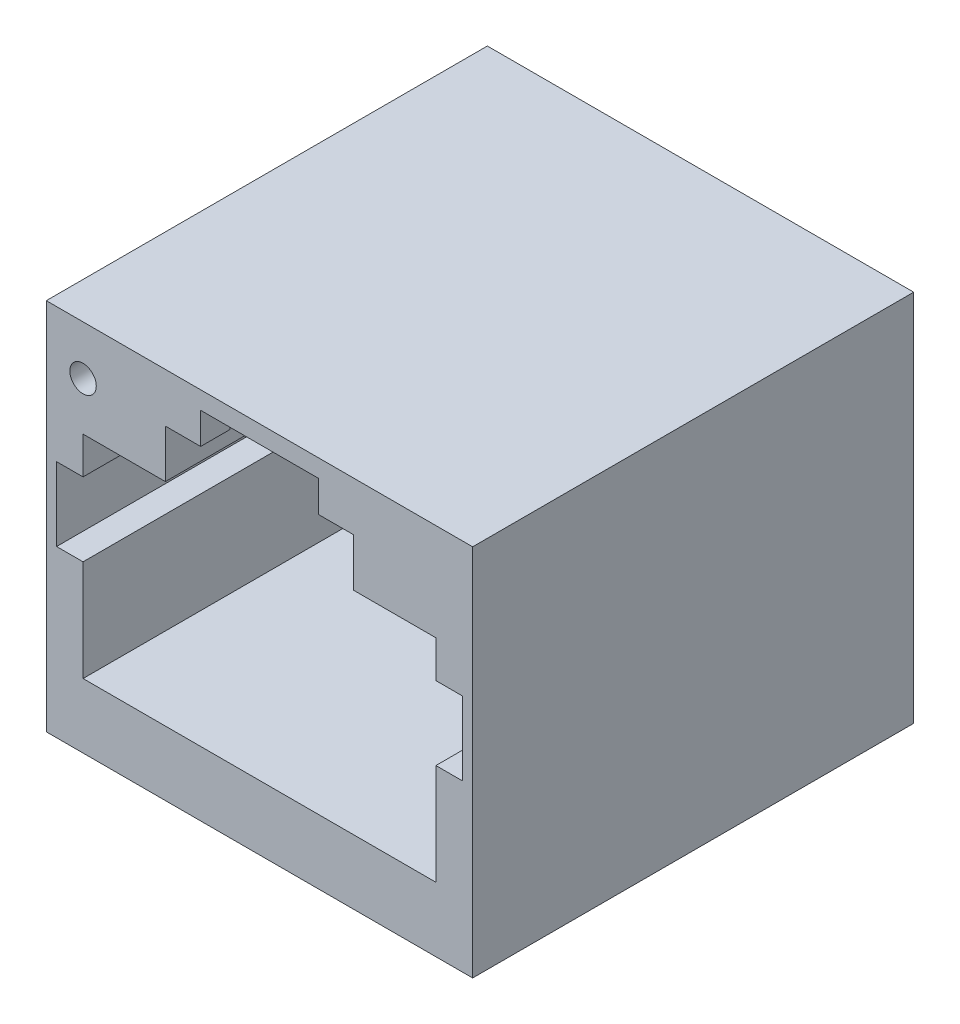
ISO-10303-21;
HEADER;
FILE_DESCRIPTION(('STEP AP214'),'2;1');
FILE_NAME('part.step','',(''),(''),'','','');
FILE_SCHEMA(('AUTOMOTIVE_DESIGN { 1 0 10303 214 1 1 1 1 }'));
ENDSEC;
DATA;
#1=APPLICATION_CONTEXT('core data for automotive mechanical design processes');
#2=APPLICATION_PROTOCOL_DEFINITION('international standard','automotive_design',2000,#1);
#3=PRODUCT_CONTEXT('',#1,'mechanical');
#4=PRODUCT('Part','Part','',(#3));
#5=PRODUCT_RELATED_PRODUCT_CATEGORY('part','',(#4));
#6=PRODUCT_DEFINITION_FORMATION('','',#4);
#7=PRODUCT_DEFINITION_CONTEXT('part definition',#1,'design');
#8=PRODUCT_DEFINITION('design','',#6,#7);
#9=PRODUCT_DEFINITION_SHAPE('','',#8);
#10=(LENGTH_UNIT() NAMED_UNIT(*) SI_UNIT(.MILLI.,.METRE.));
#11=(NAMED_UNIT(*) PLANE_ANGLE_UNIT() SI_UNIT($,.RADIAN.));
#12=(NAMED_UNIT(*) SI_UNIT($,.STERADIAN.) SOLID_ANGLE_UNIT());
#13=UNCERTAINTY_MEASURE_WITH_UNIT(LENGTH_MEASURE(1.E-05),#10,'distance_accuracy_value','');
#14=(GEOMETRIC_REPRESENTATION_CONTEXT(3) GLOBAL_UNCERTAINTY_ASSIGNED_CONTEXT((#13)) GLOBAL_UNIT_ASSIGNED_CONTEXT((#10,
#11,#12)) REPRESENTATION_CONTEXT('',''));
#15=CARTESIAN_POINT('',(0.,0.,0.));
#16=DIRECTION('',(0.,0.,1.));
#17=DIRECTION('',(1.,0.,0.));
#18=AXIS2_PLACEMENT_3D('',#15,#16,#17);
#19=CARTESIAN_POINT('',(2.,0.,-6.5));
#20=DIRECTION('',(1.,0.,0.));
#21=DIRECTION('',(0.,0.,-1.));
#22=AXIS2_PLACEMENT_3D('',#19,#20,#21);
#23=PLANE('',#22);
#24=DIRECTION('',(0.,0.,-1.));
#25=VECTOR('',#24,1.);
#26=CARTESIAN_POINT('',(2.,11.9952101661545,6.5));
#27=LINE('',#26,#25);
#28=CARTESIAN_POINT('',(2.,11.9952101661545,6.5));
#29=VERTEX_POINT('',#28);
#30=CARTESIAN_POINT('',(2.,11.9952101661545,5.));
#31=VERTEX_POINT('',#30);
#32=EDGE_CURVE('E315',#29,#31,#27,.T.);
#33=ORIENTED_EDGE('',*,*,#32,.F.);
#34=DIRECTION('',(0.,-1.,0.));
#35=VECTOR('',#34,1.);
#36=CARTESIAN_POINT('',(2.,11.0304904761697,6.5));
#37=LINE('',#36,#35);
#38=CARTESIAN_POINT('',(2.,11.0304904761697,6.5));
#39=VERTEX_POINT('',#38);
#40=EDGE_CURVE('E295',#29,#39,#37,.T.);
#41=ORIENTED_EDGE('',*,*,#40,.T.);
#42=DIRECTION('',(0.,0.,1.));
#43=VECTOR('',#42,1.);
#44=CARTESIAN_POINT('',(2.,11.0304904761697,-6.5));
#45=LINE('',#44,#43);
#46=CARTESIAN_POINT('',(2.,11.0304904761697,7.5));
#47=VERTEX_POINT('',#46);
#48=EDGE_CURVE('E449',#39,#47,#45,.T.);
#49=ORIENTED_EDGE('',*,*,#48,.T.);
#50=DIRECTION('',(0.,1.,0.));
#51=VECTOR('',#50,1.);
#52=CARTESIAN_POINT('',(2.,0.,7.5));
#53=LINE('',#52,#51);
#54=CARTESIAN_POINT('',(2.,12.0952101661545,7.5));
#55=VERTEX_POINT('',#54);
#56=EDGE_CURVE('E394',#47,#55,#53,.T.);
#57=ORIENTED_EDGE('',*,*,#56,.T.);
#58=DIRECTION('',(0.,0.,1.));
#59=VECTOR('',#58,1.);
#60=CARTESIAN_POINT('',(2.,12.0952101661545,-6.5));
#61=LINE('',#60,#59);
#62=CARTESIAN_POINT('',(2.,12.0952101661545,5.));
#63=VERTEX_POINT('',#62);
#64=EDGE_CURVE('E447',#63,#55,#61,.T.);
#65=ORIENTED_EDGE('',*,*,#64,.F.);
#66=DIRECTION('',(0.,1.,0.));
#67=VECTOR('',#66,1.);
#68=CARTESIAN_POINT('',(2.,0.,5.));
#69=LINE('',#68,#67);
#70=EDGE_CURVE('E341',#31,#63,#69,.T.);
#71=ORIENTED_EDGE('',*,*,#70,.F.);
#72=EDGE_LOOP('',(#33,#41,#49,#57,#65,#71));
#73=FACE_BOUND('',#72,.T.);
#74=ADVANCED_FACE('F95',(#73),#23,.F.);
#75=CARTESIAN_POINT('',(-2.,0.,-6.5));
#76=DIRECTION('',(1.,0.,0.));
#77=DIRECTION('',(0.,0.,-1.));
#78=AXIS2_PLACEMENT_3D('',#75,#76,#77);
#79=PLANE('',#78);
#80=DIRECTION('',(0.,1.,0.));
#81=VECTOR('',#80,1.);
#82=CARTESIAN_POINT('',(-2.,11.0304904761697,6.5));
#83=LINE('',#82,#81);
#84=CARTESIAN_POINT('',(-2.,11.0304904761697,6.5));
#85=VERTEX_POINT('',#84);
#86=CARTESIAN_POINT('',(-2.,11.9952101661545,6.5));
#87=VERTEX_POINT('',#86);
#88=EDGE_CURVE('E326',#85,#87,#83,.T.);
#89=ORIENTED_EDGE('',*,*,#88,.T.);
#90=DIRECTION('',(0.,0.,-1.));
#91=VECTOR('',#90,1.);
#92=CARTESIAN_POINT('',(-2.,11.9952101661545,6.5));
#93=LINE('',#92,#91);
#94=CARTESIAN_POINT('',(-2.,11.9952101661545,5.));
#95=VERTEX_POINT('',#94);
#96=EDGE_CURVE('E333',#87,#95,#93,.T.);
#97=ORIENTED_EDGE('',*,*,#96,.T.);
#98=DIRECTION('',(0.,-1.,0.));
#99=VECTOR('',#98,1.);
#100=CARTESIAN_POINT('',(-2.,0.,5.));
#101=LINE('',#100,#99);
#102=CARTESIAN_POINT('',(-2.,12.0952101661545,5.));
#103=VERTEX_POINT('',#102);
#104=EDGE_CURVE('E335',#103,#95,#101,.T.);
#105=ORIENTED_EDGE('',*,*,#104,.F.);
#106=DIRECTION('',(0.,0.,1.));
#107=VECTOR('',#106,1.);
#108=CARTESIAN_POINT('',(-2.,12.0952101661545,-6.5));
#109=LINE('',#108,#107);
#110=CARTESIAN_POINT('',(-2.,12.0952101661545,7.5));
#111=VERTEX_POINT('',#110);
#112=EDGE_CURVE('E445',#103,#111,#109,.T.);
#113=ORIENTED_EDGE('',*,*,#112,.T.);
#114=DIRECTION('',(0.,1.,0.));
#115=VECTOR('',#114,1.);
#116=CARTESIAN_POINT('',(-2.,0.,7.5));
#117=LINE('',#116,#115);
#118=CARTESIAN_POINT('',(-2.,11.0304904761697,7.5));
#119=VERTEX_POINT('',#118);
#120=EDGE_CURVE('E401',#119,#111,#117,.T.);
#121=ORIENTED_EDGE('',*,*,#120,.F.);
#122=DIRECTION('',(0.,0.,1.));
#123=VECTOR('',#122,1.);
#124=CARTESIAN_POINT('',(-2.,11.0304904761697,-6.5));
#125=LINE('',#124,#123);
#126=EDGE_CURVE('E443',#85,#119,#125,.T.);
#127=ORIENTED_EDGE('',*,*,#126,.F.);
#128=EDGE_LOOP('',(#89,#97,#105,#113,#121,#127));
#129=FACE_BOUND('',#128,.T.);
#130=ADVANCED_FACE('F560',(#129),#79,.T.);
#131=CARTESIAN_POINT('',(0.,11.0304904761697,-6.5));
#132=DIRECTION('',(0.,-1.,0.));
#133=DIRECTION('',(0.,0.,-1.));
#134=AXIS2_PLACEMENT_3D('',#131,#132,#133);
#135=PLANE('',#134);
#136=DIRECTION('',(0.,0.,1.));
#137=VECTOR('',#136,1.);
#138=CARTESIAN_POINT('',(-3.2,11.0304904761697,-6.5));
#139=LINE('',#138,#137);
#140=CARTESIAN_POINT('',(-3.2,11.0304904761697,6.5));
#141=VERTEX_POINT('',#140);
#142=CARTESIAN_POINT('',(-3.2,11.0304904761697,7.5));
#143=VERTEX_POINT('',#142);
#144=EDGE_CURVE('E441',#141,#143,#139,.T.);
#145=ORIENTED_EDGE('',*,*,#144,.F.);
#146=DIRECTION('',(1.,0.,0.));
#147=VECTOR('',#146,1.);
#148=CARTESIAN_POINT('',(-3.2,11.0304904761697,6.5));
#149=LINE('',#148,#147);
#150=EDGE_CURVE('E318',#141,#85,#149,.T.);
#151=ORIENTED_EDGE('',*,*,#150,.T.);
#152=ORIENTED_EDGE('',*,*,#126,.T.);
#153=DIRECTION('',(1.,0.,0.));
#154=VECTOR('',#153,1.);
#155=CARTESIAN_POINT('',(0.,11.0304904761697,7.5));
#156=LINE('',#155,#154);
#157=EDGE_CURVE('E395',#143,#119,#156,.T.);
#158=ORIENTED_EDGE('',*,*,#157,.F.);
#159=EDGE_LOOP('',(#145,#151,#152,#158));
#160=FACE_BOUND('',#159,.T.);
#161=ADVANCED_FACE('F554',(#160),#135,.T.);
#162=CARTESIAN_POINT('',(0.,0.,-6.5));
#163=DIRECTION('',(0.,0.,1.));
#164=DIRECTION('',(1.,0.,0.));
#165=AXIS2_PLACEMENT_3D('',#162,#163,#164);
#166=PLANE('',#165);
#167=DIRECTION('',(0.,1.,0.));
#168=VECTOR('',#167,1.);
#169=CARTESIAN_POINT('',(3.2,0.,-6.5));
#170=LINE('',#169,#168);
#171=CARTESIAN_POINT('',(3.2,9.39521016615454,-6.5));
#172=VERTEX_POINT('',#171);
#173=CARTESIAN_POINT('',(3.2,11.9952101661545,-6.5));
#174=VERTEX_POINT('',#173);
#175=EDGE_CURVE('E360',#172,#174,#170,.T.);
#176=ORIENTED_EDGE('',*,*,#175,.T.);
#177=DIRECTION('',(1.,0.,0.));
#178=VECTOR('',#177,1.);
#179=CARTESIAN_POINT('',(0.,11.9952101661545,-6.5));
#180=LINE('',#179,#178);
#181=CARTESIAN_POINT('',(-3.2,11.9952101661545,-6.5));
#182=VERTEX_POINT('',#181);
#183=EDGE_CURVE('E313',#182,#174,#180,.T.);
#184=ORIENTED_EDGE('',*,*,#183,.F.);
#185=DIRECTION('',(0.,1.,0.));
#186=VECTOR('',#185,1.);
#187=CARTESIAN_POINT('',(-3.2,0.,-6.5));
#188=LINE('',#187,#186);
#189=CARTESIAN_POINT('',(-3.2,9.39521016615454,-6.5));
#190=VERTEX_POINT('',#189);
#191=EDGE_CURVE('E363',#190,#182,#188,.T.);
#192=ORIENTED_EDGE('',*,*,#191,.F.);
#193=DIRECTION('',(1.,0.,0.));
#194=VECTOR('',#193,1.);
#195=CARTESIAN_POINT('',(0.,9.39521016615454,-6.5));
#196=LINE('',#195,#194);
#197=CARTESIAN_POINT('',(-6.,9.39521016615454,-6.5));
#198=VERTEX_POINT('',#197);
#199=EDGE_CURVE('E361',#198,#190,#196,.T.);
#200=ORIENTED_EDGE('',*,*,#199,.F.);
#201=DIRECTION('',(0.,-1.,0.));
#202=VECTOR('',#201,1.);
#203=CARTESIAN_POINT('',(-6.,0.,-6.5));
#204=LINE('',#203,#202);
#205=CARTESIAN_POINT('',(-6.,8.13316812527137,-6.5));
#206=VERTEX_POINT('',#205);
#207=EDGE_CURVE('E365',#198,#206,#204,.T.);
#208=ORIENTED_EDGE('',*,*,#207,.T.);
#209=DIRECTION('',(-1.,0.,0.));
#210=VECTOR('',#209,1.);
#211=CARTESIAN_POINT('',(-6.,8.13316812527137,-6.5));
#212=LINE('',#211,#210);
#213=CARTESIAN_POINT('',(-6.9,8.13316812527137,-6.5));
#214=VERTEX_POINT('',#213);
#215=EDGE_CURVE('E455',#206,#214,#212,.T.);
#216=ORIENTED_EDGE('',*,*,#215,.T.);
#217=DIRECTION('',(0.,-1.,0.));
#218=VECTOR('',#217,1.);
#219=CARTESIAN_POINT('',(-6.9,8.13316812527137,-6.5));
#220=LINE('',#219,#218);
#221=CARTESIAN_POINT('',(-6.9,5.63316812527137,-6.5));
#222=VERTEX_POINT('',#221);
#223=EDGE_CURVE('E458',#214,#222,#220,.T.);
#224=ORIENTED_EDGE('',*,*,#223,.T.);
#225=DIRECTION('',(-1.,0.,0.));
#226=VECTOR('',#225,1.);
#227=CARTESIAN_POINT('',(-6.,5.63316812527137,-6.5));
#228=LINE('',#227,#226);
#229=CARTESIAN_POINT('',(-6.,5.63316812527137,-6.5));
#230=VERTEX_POINT('',#229);
#231=EDGE_CURVE('E462',#230,#222,#228,.T.);
#232=ORIENTED_EDGE('',*,*,#231,.F.);
#233=CARTESIAN_POINT('',(-6.,2.19521016615454,-6.5));
#234=VERTEX_POINT('',#233);
#235=EDGE_CURVE('E369',#230,#234,#204,.T.);
#236=ORIENTED_EDGE('',*,*,#235,.T.);
#237=DIRECTION('',(1.,0.,0.));
#238=VECTOR('',#237,1.);
#239=CARTESIAN_POINT('',(0.,2.19521016615454,-6.5));
#240=LINE('',#239,#238);
#241=CARTESIAN_POINT('',(6.,2.19521016615454,-6.5));
#242=VERTEX_POINT('',#241);
#243=EDGE_CURVE('E368',#234,#242,#240,.T.);
#244=ORIENTED_EDGE('',*,*,#243,.T.);
#245=DIRECTION('',(0.,-1.,0.));
#246=VECTOR('',#245,1.);
#247=CARTESIAN_POINT('',(6.,0.,-6.5));
#248=LINE('',#247,#246);
#249=CARTESIAN_POINT('',(6.,5.63316812527137,-6.5));
#250=VERTEX_POINT('',#249);
#251=EDGE_CURVE('E358',#250,#242,#248,.T.);
#252=ORIENTED_EDGE('',*,*,#251,.F.);
#253=DIRECTION('',(1.,0.,0.));
#254=VECTOR('',#253,1.);
#255=CARTESIAN_POINT('',(0.,5.63316812527137,-6.5));
#256=LINE('',#255,#254);
#257=CARTESIAN_POINT('',(6.9,5.63316812527137,-6.5));
#258=VERTEX_POINT('',#257);
#259=EDGE_CURVE('E372',#250,#258,#256,.T.);
#260=ORIENTED_EDGE('',*,*,#259,.T.);
#261=DIRECTION('',(0.,-1.,0.));
#262=VECTOR('',#261,1.);
#263=CARTESIAN_POINT('',(6.9,0.,-6.5));
#264=LINE('',#263,#262);
#265=CARTESIAN_POINT('',(6.9,8.13316812527137,-6.5));
#266=VERTEX_POINT('',#265);
#267=EDGE_CURVE('E375',#266,#258,#264,.T.);
#268=ORIENTED_EDGE('',*,*,#267,.F.);
#269=DIRECTION('',(1.,0.,0.));
#270=VECTOR('',#269,1.);
#271=CARTESIAN_POINT('',(0.,8.13316812527137,-6.5));
#272=LINE('',#271,#270);
#273=CARTESIAN_POINT('',(6.,8.13316812527137,-6.5));
#274=VERTEX_POINT('',#273);
#275=EDGE_CURVE('E377',#274,#266,#272,.T.);
#276=ORIENTED_EDGE('',*,*,#275,.F.);
#277=CARTESIAN_POINT('',(6.,9.39521016615454,-6.5));
#278=VERTEX_POINT('',#277);
#279=EDGE_CURVE('E353',#278,#274,#248,.T.);
#280=ORIENTED_EDGE('',*,*,#279,.F.);
#281=EDGE_CURVE('E356',#172,#278,#196,.T.);
#282=ORIENTED_EDGE('',*,*,#281,.F.);
#283=EDGE_LOOP('',(#176,#184,#192,#200,#208,#216,#224,#232,#236,#244,#252,#260,#268,#276,#280,#282));
#284=FACE_BOUND('',#283,.T.);
#285=ADVANCED_FACE('F507',(#284),#166,.T.);
#286=CARTESIAN_POINT('',(-7.25,12.7,7.5));
#287=DIRECTION('',(0.,0.,-1.));
#288=DIRECTION('',(-1.,0.,0.));
#289=AXIS2_PLACEMENT_3D('',#286,#287,#288);
#290=PLANE('',#289);
#291=CARTESIAN_POINT('',(-6.,11.0304904761697,7.5));
#292=DIRECTION('',(0.,0.,1.));
#293=DIRECTION('',(1.,0.,0.));
#294=AXIS2_PLACEMENT_3D('',#291,#292,#293);
#295=CIRCLE('',#294,0.45);
#296=CARTESIAN_POINT('',(-5.55,11.0304904761697,7.5));
#297=VERTEX_POINT('',#296);
#298=EDGE_CURVE('E345',#297,#297,#295,.T.);
#299=ORIENTED_EDGE('',*,*,#298,.F.);
#300=EDGE_LOOP('',(#299));
#301=FACE_BOUND('',#300,.T.);
#302=DIRECTION('',(1.,0.,0.));
#303=VECTOR('',#302,1.);
#304=CARTESIAN_POINT('',(-7.25,0.,7.5));
#305=LINE('',#304,#303);
#306=CARTESIAN_POINT('',(-7.25,0.,7.5));
#307=VERTEX_POINT('',#306);
#308=CARTESIAN_POINT('',(7.25,0.,7.5));
#309=VERTEX_POINT('',#308);
#310=EDGE_CURVE('E140',#307,#309,#305,.T.);
#311=ORIENTED_EDGE('',*,*,#310,.T.);
#312=DIRECTION('',(0.,-1.,0.));
#313=VECTOR('',#312,1.);
#314=CARTESIAN_POINT('',(7.25,12.7,7.5));
#315=LINE('',#314,#313);
#316=CARTESIAN_POINT('',(7.25,12.7,7.5));
#317=VERTEX_POINT('',#316);
#318=EDGE_CURVE('E482',#317,#309,#315,.T.);
#319=ORIENTED_EDGE('',*,*,#318,.F.);
#320=DIRECTION('',(1.,0.,0.));
#321=VECTOR('',#320,1.);
#322=CARTESIAN_POINT('',(-7.25,12.7,7.5));
#323=LINE('',#322,#321);
#324=CARTESIAN_POINT('',(-7.25,12.7,7.5));
#325=VERTEX_POINT('',#324);
#326=EDGE_CURVE('E119',#325,#317,#323,.T.);
#327=ORIENTED_EDGE('',*,*,#326,.F.);
#328=DIRECTION('',(0.,-1.,0.));
#329=VECTOR('',#328,1.);
#330=CARTESIAN_POINT('',(-7.25,12.7,7.5));
#331=LINE('',#330,#329);
#332=EDGE_CURVE('E491',#325,#307,#331,.T.);
#333=ORIENTED_EDGE('',*,*,#332,.T.);
#334=EDGE_LOOP('',(#311,#319,#327,#333));
#335=FACE_BOUND('',#334,.T.);
#336=DIRECTION('',(0.,-1.,0.));
#337=VECTOR('',#336,1.);
#338=CARTESIAN_POINT('',(6.9,0.,7.5));
#339=LINE('',#338,#337);
#340=CARTESIAN_POINT('',(6.9,8.13316812527137,7.5));
#341=VERTEX_POINT('',#340);
#342=CARTESIAN_POINT('',(6.9,5.63316812527137,7.5));
#343=VERTEX_POINT('',#342);
#344=EDGE_CURVE('E417',#341,#343,#339,.T.);
#345=ORIENTED_EDGE('',*,*,#344,.T.);
#346=DIRECTION('',(1.,0.,0.));
#347=VECTOR('',#346,1.);
#348=CARTESIAN_POINT('',(0.,5.63316812527137,7.5));
#349=LINE('',#348,#347);
#350=CARTESIAN_POINT('',(6.,5.63316812527137,7.5));
#351=VERTEX_POINT('',#350);
#352=EDGE_CURVE('E414',#351,#343,#349,.T.);
#353=ORIENTED_EDGE('',*,*,#352,.F.);
#354=DIRECTION('',(0.,-1.,0.));
#355=VECTOR('',#354,1.);
#356=CARTESIAN_POINT('',(6.,0.,7.5));
#357=LINE('',#356,#355);
#358=CARTESIAN_POINT('',(6.,2.19521016615454,7.5));
#359=VERTEX_POINT('',#358);
#360=EDGE_CURVE('E385',#351,#359,#357,.T.);
#361=ORIENTED_EDGE('',*,*,#360,.T.);
#362=DIRECTION('',(1.,0.,0.));
#363=VECTOR('',#362,1.);
#364=CARTESIAN_POINT('',(0.,2.19521016615454,7.5));
#365=LINE('',#364,#363);
#366=CARTESIAN_POINT('',(-6.,2.19521016615454,7.5));
#367=VERTEX_POINT('',#366);
#368=EDGE_CURVE('E410',#367,#359,#365,.T.);
#369=ORIENTED_EDGE('',*,*,#368,.F.);
#370=DIRECTION('',(0.,-1.,0.));
#371=VECTOR('',#370,1.);
#372=CARTESIAN_POINT('',(-6.,0.,7.5));
#373=LINE('',#372,#371);
#374=CARTESIAN_POINT('',(-6.,5.63316812527137,7.5));
#375=VERTEX_POINT('',#374);
#376=EDGE_CURVE('E411',#375,#367,#373,.T.);
#377=ORIENTED_EDGE('',*,*,#376,.F.);
#378=DIRECTION('',(-1.,0.,0.));
#379=VECTOR('',#378,1.);
#380=CARTESIAN_POINT('',(-6.,5.63316812527137,7.5));
#381=LINE('',#380,#379);
#382=CARTESIAN_POINT('',(-6.9,5.63316812527137,7.5));
#383=VERTEX_POINT('',#382);
#384=EDGE_CURVE('E459',#375,#383,#381,.T.);
#385=ORIENTED_EDGE('',*,*,#384,.T.);
#386=DIRECTION('',(0.,-1.,0.));
#387=VECTOR('',#386,1.);
#388=CARTESIAN_POINT('',(-6.9,8.13316812527137,7.5));
#389=LINE('',#388,#387);
#390=CARTESIAN_POINT('',(-6.9,8.13316812527137,7.5));
#391=VERTEX_POINT('',#390);
#392=EDGE_CURVE('E110',#391,#383,#389,.T.);
#393=ORIENTED_EDGE('',*,*,#392,.F.);
#394=DIRECTION('',(-1.,0.,0.));
#395=VECTOR('',#394,1.);
#396=CARTESIAN_POINT('',(-6.,8.13316812527137,7.5));
#397=LINE('',#396,#395);
#398=CARTESIAN_POINT('',(-6.,8.13316812527137,7.5));
#399=VERTEX_POINT('',#398);
#400=EDGE_CURVE('E350',#399,#391,#397,.T.);
#401=ORIENTED_EDGE('',*,*,#400,.F.);
#402=CARTESIAN_POINT('',(-6.,9.39521016615454,7.5));
#403=VERTEX_POINT('',#402);
#404=EDGE_CURVE('E407',#403,#399,#373,.T.);
#405=ORIENTED_EDGE('',*,*,#404,.F.);
#406=DIRECTION('',(1.,0.,0.));
#407=VECTOR('',#406,1.);
#408=CARTESIAN_POINT('',(0.,9.39521016615454,7.5));
#409=LINE('',#408,#407);
#410=CARTESIAN_POINT('',(-3.2,9.39521016615454,7.5));
#411=VERTEX_POINT('',#410);
#412=EDGE_CURVE('E389',#403,#411,#409,.T.);
#413=ORIENTED_EDGE('',*,*,#412,.T.);
#414=DIRECTION('',(0.,1.,0.));
#415=VECTOR('',#414,1.);
#416=CARTESIAN_POINT('',(-3.2,0.,7.5));
#417=LINE('',#416,#415);
#418=EDGE_CURVE('E404',#411,#143,#417,.T.);
#419=ORIENTED_EDGE('',*,*,#418,.T.);
#420=ORIENTED_EDGE('',*,*,#157,.T.);
#421=ORIENTED_EDGE('',*,*,#120,.T.);
#422=DIRECTION('',(1.,0.,0.));
#423=VECTOR('',#422,1.);
#424=CARTESIAN_POINT('',(0.,12.0952101661545,7.5));
#425=LINE('',#424,#423);
#426=EDGE_CURVE('E398',#111,#55,#425,.T.);
#427=ORIENTED_EDGE('',*,*,#426,.T.);
#428=ORIENTED_EDGE('',*,*,#56,.F.);
#429=CARTESIAN_POINT('',(3.2,11.0304904761697,7.5));
#430=VERTEX_POINT('',#429);
#431=EDGE_CURVE('E391',#47,#430,#156,.T.);
#432=ORIENTED_EDGE('',*,*,#431,.T.);
#433=DIRECTION('',(0.,1.,0.));
#434=VECTOR('',#433,1.);
#435=CARTESIAN_POINT('',(3.2,0.,7.5));
#436=LINE('',#435,#434);
#437=CARTESIAN_POINT('',(3.2,9.39521016615454,7.5));
#438=VERTEX_POINT('',#437);
#439=EDGE_CURVE('E388',#438,#430,#436,.T.);
#440=ORIENTED_EDGE('',*,*,#439,.F.);
#441=CARTESIAN_POINT('',(6.,9.39521016615454,7.5));
#442=VERTEX_POINT('',#441);
#443=EDGE_CURVE('E383',#438,#442,#409,.T.);
#444=ORIENTED_EDGE('',*,*,#443,.T.);
#445=CARTESIAN_POINT('',(6.,8.13316812527137,7.5));
#446=VERTEX_POINT('',#445);
#447=EDGE_CURVE('E380',#442,#446,#357,.T.);
#448=ORIENTED_EDGE('',*,*,#447,.T.);
#449=DIRECTION('',(1.,0.,0.));
#450=VECTOR('',#449,1.);
#451=CARTESIAN_POINT('',(0.,8.13316812527137,7.5));
#452=LINE('',#451,#450);
#453=EDGE_CURVE('E357',#446,#341,#452,.T.);
#454=ORIENTED_EDGE('',*,*,#453,.T.);
#455=EDGE_LOOP('',(#345,#353,#361,#369,#377,#385,#393,#401,#405,#413,#419,#420,#421,#427,#428,
#432,#440,#444,#448,#454));
#456=FACE_BOUND('',#455,.T.);
#457=ADVANCED_FACE('F504',(#301,#335,#456),#290,.F.);
#458=CARTESIAN_POINT('',(7.25,12.7,7.5));
#459=DIRECTION('',(-1.,0.,0.));
#460=DIRECTION('',(0.,0.,1.));
#461=AXIS2_PLACEMENT_3D('',#458,#459,#460);
#462=PLANE('',#461);
#463=DIRECTION('',(0.,0.,-1.));
#464=VECTOR('',#463,1.);
#465=CARTESIAN_POINT('',(7.25,0.,7.5));
#466=LINE('',#465,#464);
#467=CARTESIAN_POINT('',(7.25,0.,-7.5));
#468=VERTEX_POINT('',#467);
#469=EDGE_CURVE('E473',#309,#468,#466,.T.);
#470=ORIENTED_EDGE('',*,*,#469,.T.);
#471=DIRECTION('',(0.,-1.,0.));
#472=VECTOR('',#471,1.);
#473=CARTESIAN_POINT('',(7.25,12.7,-7.5));
#474=LINE('',#473,#472);
#475=CARTESIAN_POINT('',(7.25,12.7,-7.5));
#476=VERTEX_POINT('',#475);
#477=EDGE_CURVE('E12',#476,#468,#474,.T.);
#478=ORIENTED_EDGE('',*,*,#477,.F.);
#479=DIRECTION('',(0.,0.,-1.));
#480=VECTOR('',#479,1.);
#481=CARTESIAN_POINT('',(7.25,12.7,7.5));
#482=LINE('',#481,#480);
#483=EDGE_CURVE('E476',#317,#476,#482,.T.);
#484=ORIENTED_EDGE('',*,*,#483,.F.);
#485=ORIENTED_EDGE('',*,*,#318,.T.);
#486=EDGE_LOOP('',(#470,#478,#484,#485));
#487=FACE_BOUND('',#486,.T.);
#488=ADVANCED_FACE('F97',(#487),#462,.F.);
#489=CARTESIAN_POINT('',(-7.25,12.7,-7.5));
#490=DIRECTION('',(0.,0.,1.));
#491=DIRECTION('',(1.,0.,0.));
#492=AXIS2_PLACEMENT_3D('',#489,#490,#491);
#493=PLANE('',#492);
#494=DIRECTION('',(-1.,0.,0.));
#495=VECTOR('',#494,1.);
#496=CARTESIAN_POINT('',(-7.25,0.,-7.5));
#497=LINE('',#496,#495);
#498=CARTESIAN_POINT('',(-7.25,0.,-7.5));
#499=VERTEX_POINT('',#498);
#500=EDGE_CURVE('E485',#468,#499,#497,.T.);
#501=ORIENTED_EDGE('',*,*,#500,.T.);
#502=DIRECTION('',(0.,-1.,0.));
#503=VECTOR('',#502,1.);
#504=CARTESIAN_POINT('',(-7.25,12.7,-7.5));
#505=LINE('',#504,#503);
#506=CARTESIAN_POINT('',(-7.25,12.7,-7.5));
#507=VERTEX_POINT('',#506);
#508=EDGE_CURVE('E103',#507,#499,#505,.T.);
#509=ORIENTED_EDGE('',*,*,#508,.F.);
#510=DIRECTION('',(-1.,0.,0.));
#511=VECTOR('',#510,1.);
#512=CARTESIAN_POINT('',(-7.25,12.7,-7.5));
#513=LINE('',#512,#511);
#514=EDGE_CURVE('E147',#476,#507,#513,.T.);
#515=ORIENTED_EDGE('',*,*,#514,.F.);
#516=ORIENTED_EDGE('',*,*,#477,.T.);
#517=EDGE_LOOP('',(#501,#509,#515,#516));
#518=FACE_BOUND('',#517,.T.);
#519=ADVANCED_FACE('F629',(#518),#493,.F.);
#520=CARTESIAN_POINT('',(-7.25,12.7,7.5));
#521=DIRECTION('',(1.,0.,0.));
#522=DIRECTION('',(0.,0.,-1.));
#523=AXIS2_PLACEMENT_3D('',#520,#521,#522);
#524=PLANE('',#523);
#525=DIRECTION('',(0.,0.,1.));
#526=VECTOR('',#525,1.);
#527=CARTESIAN_POINT('',(-7.25,0.,7.5));
#528=LINE('',#527,#526);
#529=EDGE_CURVE('E487',#499,#307,#528,.T.);
#530=ORIENTED_EDGE('',*,*,#529,.T.);
#531=ORIENTED_EDGE('',*,*,#332,.F.);
#532=DIRECTION('',(0.,0.,1.));
#533=VECTOR('',#532,1.);
#534=CARTESIAN_POINT('',(-7.25,12.7,7.5));
#535=LINE('',#534,#533);
#536=EDGE_CURVE('E479',#507,#325,#535,.T.);
#537=ORIENTED_EDGE('',*,*,#536,.F.);
#538=ORIENTED_EDGE('',*,*,#508,.T.);
#539=EDGE_LOOP('',(#530,#531,#537,#538));
#540=FACE_BOUND('',#539,.T.);
#541=ADVANCED_FACE('F496',(#540),#524,.F.);
#542=CARTESIAN_POINT('',(0.,12.7,0.));
#543=DIRECTION('',(0.,-1.,0.));
#544=DIRECTION('',(0.,0.,-1.));
#545=AXIS2_PLACEMENT_3D('',#542,#543,#544);
#546=PLANE('',#545);
#547=ORIENTED_EDGE('',*,*,#483,.T.);
#548=ORIENTED_EDGE('',*,*,#514,.T.);
#549=ORIENTED_EDGE('',*,*,#536,.T.);
#550=ORIENTED_EDGE('',*,*,#326,.T.);
#551=EDGE_LOOP('',(#547,#548,#549,#550));
#552=FACE_BOUND('',#551,.T.);
#553=ADVANCED_FACE('F623',(#552),#546,.F.);
#554=CARTESIAN_POINT('',(0.,0.,0.));
#555=DIRECTION('',(0.,-1.,0.));
#556=DIRECTION('',(0.,0.,-1.));
#557=AXIS2_PLACEMENT_3D('',#554,#555,#556);
#558=PLANE('',#557);
#559=ORIENTED_EDGE('',*,*,#469,.F.);
#560=ORIENTED_EDGE('',*,*,#310,.F.);
#561=ORIENTED_EDGE('',*,*,#529,.F.);
#562=ORIENTED_EDGE('',*,*,#500,.F.);
#563=EDGE_LOOP('',(#559,#560,#561,#562));
#564=FACE_BOUND('',#563,.T.);
#565=ADVANCED_FACE('F500',(#564),#558,.T.);
#566=CARTESIAN_POINT('',(0.,9.39521016615454,-6.5));
#567=DIRECTION('',(0.,-1.,0.));
#568=DIRECTION('',(0.,0.,-1.));
#569=AXIS2_PLACEMENT_3D('',#566,#567,#568);
#570=PLANE('',#569);
#571=ORIENTED_EDGE('',*,*,#443,.F.);
#572=DIRECTION('',(0.,0.,1.));
#573=VECTOR('',#572,1.);
#574=CARTESIAN_POINT('',(3.2,9.39521016615454,-6.5));
#575=LINE('',#574,#573);
#576=EDGE_CURVE('E452',#172,#438,#575,.T.);
#577=ORIENTED_EDGE('',*,*,#576,.F.);
#578=ORIENTED_EDGE('',*,*,#281,.T.);
#579=DIRECTION('',(0.,0.,1.));
#580=VECTOR('',#579,1.);
#581=CARTESIAN_POINT('',(6.,9.39521016615454,-6.5));
#582=LINE('',#581,#580);
#583=EDGE_CURVE('E379',#278,#442,#582,.T.);
#584=ORIENTED_EDGE('',*,*,#583,.T.);
#585=EDGE_LOOP('',(#571,#577,#578,#584));
#586=FACE_BOUND('',#585,.T.);
#587=ADVANCED_FACE('F577',(#586),#570,.T.);
#588=CARTESIAN_POINT('',(3.2,0.,-6.5));
#589=DIRECTION('',(1.,0.,0.));
#590=DIRECTION('',(0.,0.,-1.));
#591=AXIS2_PLACEMENT_3D('',#588,#589,#590);
#592=PLANE('',#591);
#593=ORIENTED_EDGE('',*,*,#439,.T.);
#594=DIRECTION('',(0.,0.,1.));
#595=VECTOR('',#594,1.);
#596=CARTESIAN_POINT('',(3.2,11.0304904761697,-6.5));
#597=LINE('',#596,#595);
#598=CARTESIAN_POINT('',(3.2,11.0304904761697,6.5));
#599=VERTEX_POINT('',#598);
#600=EDGE_CURVE('E307',#599,#430,#597,.T.);
#601=ORIENTED_EDGE('',*,*,#600,.F.);
#602=DIRECTION('',(0.,1.,0.));
#603=VECTOR('',#602,1.);
#604=CARTESIAN_POINT('',(3.2,11.0304904761697,6.5));
#605=LINE('',#604,#603);
#606=CARTESIAN_POINT('',(3.2,11.9952101661545,6.5));
#607=VERTEX_POINT('',#606);
#608=EDGE_CURVE('E292',#599,#607,#605,.T.);
#609=ORIENTED_EDGE('',*,*,#608,.T.);
#610=DIRECTION('',(0.,0.,-1.));
#611=VECTOR('',#610,1.);
#612=CARTESIAN_POINT('',(3.2,11.9952101661545,6.5));
#613=LINE('',#612,#611);
#614=EDGE_CURVE('E306',#607,#174,#613,.T.);
#615=ORIENTED_EDGE('',*,*,#614,.T.);
#616=ORIENTED_EDGE('',*,*,#175,.F.);
#617=ORIENTED_EDGE('',*,*,#576,.T.);
#618=EDGE_LOOP('',(#593,#601,#609,#615,#616,#617));
#619=FACE_BOUND('',#618,.T.);
#620=ADVANCED_FACE('F304',(#619),#592,.F.);
#621=DIRECTION('',(1.,0.,0.));
#622=VECTOR('',#621,1.);
#623=CARTESIAN_POINT('',(3.2,11.0304904761697,6.5));
#624=LINE('',#623,#622);
#625=EDGE_CURVE('E320',#39,#599,#624,.T.);
#626=ORIENTED_EDGE('',*,*,#625,.T.);
#627=ORIENTED_EDGE('',*,*,#600,.T.);
#628=ORIENTED_EDGE('',*,*,#431,.F.);
#629=ORIENTED_EDGE('',*,*,#48,.F.);
#630=EDGE_LOOP('',(#626,#627,#628,#629));
#631=FACE_BOUND('',#630,.T.);
#632=ADVANCED_FACE('F573',(#631),#135,.T.);
#633=CARTESIAN_POINT('',(0.,12.0952101661545,-6.5));
#634=DIRECTION('',(0.,-1.,0.));
#635=DIRECTION('',(0.,0.,-1.));
#636=AXIS2_PLACEMENT_3D('',#633,#634,#635);
#637=PLANE('',#636);
#638=DIRECTION('',(-1.,0.,0.));
#639=VECTOR('',#638,1.);
#640=CARTESIAN_POINT('',(0.,12.0952101661545,5.));
#641=LINE('',#640,#639);
#642=EDGE_CURVE('E343',#63,#103,#641,.T.);
#643=ORIENTED_EDGE('',*,*,#642,.F.);
#644=ORIENTED_EDGE('',*,*,#64,.T.);
#645=ORIENTED_EDGE('',*,*,#426,.F.);
#646=ORIENTED_EDGE('',*,*,#112,.F.);
#647=EDGE_LOOP('',(#643,#644,#645,#646));
#648=FACE_BOUND('',#647,.T.);
#649=ADVANCED_FACE('F565',(#648),#637,.T.);
#650=CARTESIAN_POINT('',(-3.2,0.,-6.5));
#651=DIRECTION('',(1.,0.,0.));
#652=DIRECTION('',(0.,0.,-1.));
#653=AXIS2_PLACEMENT_3D('',#650,#651,#652);
#654=PLANE('',#653);
#655=ORIENTED_EDGE('',*,*,#418,.F.);
#656=DIRECTION('',(0.,0.,1.));
#657=VECTOR('',#656,1.);
#658=CARTESIAN_POINT('',(-3.2,9.39521016615454,-6.5));
#659=LINE('',#658,#657);
#660=EDGE_CURVE('E439',#190,#411,#659,.T.);
#661=ORIENTED_EDGE('',*,*,#660,.F.);
#662=ORIENTED_EDGE('',*,*,#191,.T.);
#663=DIRECTION('',(0.,0.,-1.));
#664=VECTOR('',#663,1.);
#665=CARTESIAN_POINT('',(-3.2,11.9952101661545,6.5));
#666=LINE('',#665,#664);
#667=CARTESIAN_POINT('',(-3.2,11.9952101661545,6.5));
#668=VERTEX_POINT('',#667);
#669=EDGE_CURVE('E331',#668,#182,#666,.T.);
#670=ORIENTED_EDGE('',*,*,#669,.F.);
#671=DIRECTION('',(0.,-1.,0.));
#672=VECTOR('',#671,1.);
#673=CARTESIAN_POINT('',(-3.2,11.0304904761697,6.5));
#674=LINE('',#673,#672);
#675=EDGE_CURVE('E314',#668,#141,#674,.T.);
#676=ORIENTED_EDGE('',*,*,#675,.T.);
#677=ORIENTED_EDGE('',*,*,#144,.T.);
#678=EDGE_LOOP('',(#655,#661,#662,#670,#676,#677));
#679=FACE_BOUND('',#678,.T.);
#680=ADVANCED_FACE('F548',(#679),#654,.T.);
#681=CARTESIAN_POINT('',(6.,0.,-6.5));
#682=DIRECTION('',(-1.,0.,0.));
#683=DIRECTION('',(0.,0.,1.));
#684=AXIS2_PLACEMENT_3D('',#681,#682,#683);
#685=PLANE('',#684);
#686=ORIENTED_EDGE('',*,*,#360,.F.);
#687=DIRECTION('',(0.,0.,1.));
#688=VECTOR('',#687,1.);
#689=CARTESIAN_POINT('',(6.,5.63316812527137,-6.5));
#690=LINE('',#689,#688);
#691=EDGE_CURVE('E430',#250,#351,#690,.T.);
#692=ORIENTED_EDGE('',*,*,#691,.F.);
#693=ORIENTED_EDGE('',*,*,#251,.T.);
#694=DIRECTION('',(0.,0.,1.));
#695=VECTOR('',#694,1.);
#696=CARTESIAN_POINT('',(6.,2.19521016615454,-6.5));
#697=LINE('',#696,#695);
#698=EDGE_CURVE('E432',#242,#359,#697,.T.);
#699=ORIENTED_EDGE('',*,*,#698,.T.);
#700=EDGE_LOOP('',(#686,#692,#693,#699));
#701=FACE_BOUND('',#700,.T.);
#702=ADVANCED_FACE('F524',(#701),#685,.T.);
#703=CARTESIAN_POINT('',(0.,5.63316812527137,-6.5));
#704=DIRECTION('',(0.,-1.,0.));
#705=DIRECTION('',(0.,0.,-1.));
#706=AXIS2_PLACEMENT_3D('',#703,#704,#705);
#707=PLANE('',#706);
#708=ORIENTED_EDGE('',*,*,#352,.T.);
#709=DIRECTION('',(0.,0.,1.));
#710=VECTOR('',#709,1.);
#711=CARTESIAN_POINT('',(6.9,5.63316812527137,-6.5));
#712=LINE('',#711,#710);
#713=EDGE_CURVE('E428',#258,#343,#712,.T.);
#714=ORIENTED_EDGE('',*,*,#713,.F.);
#715=ORIENTED_EDGE('',*,*,#259,.F.);
#716=ORIENTED_EDGE('',*,*,#691,.T.);
#717=EDGE_LOOP('',(#708,#714,#715,#716));
#718=FACE_BOUND('',#717,.T.);
#719=ADVANCED_FACE('F520',(#718),#707,.F.);
#720=CARTESIAN_POINT('',(6.9,0.,-6.5));
#721=DIRECTION('',(-1.,0.,0.));
#722=DIRECTION('',(0.,-1.,0.));
#723=AXIS2_PLACEMENT_3D('',#720,#721,#722);
#724=PLANE('',#723);
#725=ORIENTED_EDGE('',*,*,#344,.F.);
#726=DIRECTION('',(0.,0.,1.));
#727=VECTOR('',#726,1.);
#728=CARTESIAN_POINT('',(6.9,8.13316812527137,-6.5));
#729=LINE('',#728,#727);
#730=EDGE_CURVE('E426',#266,#341,#729,.T.);
#731=ORIENTED_EDGE('',*,*,#730,.F.);
#732=ORIENTED_EDGE('',*,*,#267,.T.);
#733=ORIENTED_EDGE('',*,*,#713,.T.);
#734=EDGE_LOOP('',(#725,#731,#732,#733));
#735=FACE_BOUND('',#734,.T.);
#736=ADVANCED_FACE('F515',(#735),#724,.T.);
#737=CARTESIAN_POINT('',(0.,8.13316812527137,-6.5));
#738=DIRECTION('',(0.,-1.,0.));
#739=DIRECTION('',(0.,0.,-1.));
#740=AXIS2_PLACEMENT_3D('',#737,#738,#739);
#741=PLANE('',#740);
#742=ORIENTED_EDGE('',*,*,#453,.F.);
#743=DIRECTION('',(0.,0.,1.));
#744=VECTOR('',#743,1.);
#745=CARTESIAN_POINT('',(6.,8.13316812527137,-6.5));
#746=LINE('',#745,#744);
#747=EDGE_CURVE('E422',#274,#446,#746,.T.);
#748=ORIENTED_EDGE('',*,*,#747,.F.);
#749=ORIENTED_EDGE('',*,*,#275,.T.);
#750=ORIENTED_EDGE('',*,*,#730,.T.);
#751=EDGE_LOOP('',(#742,#748,#749,#750));
#752=FACE_BOUND('',#751,.T.);
#753=ADVANCED_FACE('F585',(#752),#741,.T.);
#754=ORIENTED_EDGE('',*,*,#447,.F.);
#755=ORIENTED_EDGE('',*,*,#583,.F.);
#756=ORIENTED_EDGE('',*,*,#279,.T.);
#757=ORIENTED_EDGE('',*,*,#747,.T.);
#758=EDGE_LOOP('',(#754,#755,#756,#757));
#759=FACE_BOUND('',#758,.T.);
#760=ADVANCED_FACE('F581',(#759),#685,.T.);
#761=CARTESIAN_POINT('',(0.,2.19521016615454,-6.5));
#762=DIRECTION('',(0.,-1.,0.));
#763=DIRECTION('',(0.,0.,-1.));
#764=AXIS2_PLACEMENT_3D('',#761,#762,#763);
#765=PLANE('',#764);
#766=ORIENTED_EDGE('',*,*,#368,.T.);
#767=ORIENTED_EDGE('',*,*,#698,.F.);
#768=ORIENTED_EDGE('',*,*,#243,.F.);
#769=DIRECTION('',(0.,0.,1.));
#770=VECTOR('',#769,1.);
#771=CARTESIAN_POINT('',(-6.,2.19521016615454,-6.5));
#772=LINE('',#771,#770);
#773=EDGE_CURVE('E434',#234,#367,#772,.T.);
#774=ORIENTED_EDGE('',*,*,#773,.T.);
#775=EDGE_LOOP('',(#766,#767,#768,#774));
#776=FACE_BOUND('',#775,.T.);
#777=ADVANCED_FACE('F529',(#776),#765,.F.);
#778=ORIENTED_EDGE('',*,*,#412,.F.);
#779=DIRECTION('',(0.,0.,1.));
#780=VECTOR('',#779,1.);
#781=CARTESIAN_POINT('',(-6.,9.39521016615454,-6.5));
#782=LINE('',#781,#780);
#783=EDGE_CURVE('E437',#198,#403,#782,.T.);
#784=ORIENTED_EDGE('',*,*,#783,.F.);
#785=ORIENTED_EDGE('',*,*,#199,.T.);
#786=ORIENTED_EDGE('',*,*,#660,.T.);
#787=EDGE_LOOP('',(#778,#784,#785,#786));
#788=FACE_BOUND('',#787,.T.);
#789=ADVANCED_FACE('F543',(#788),#570,.T.);
#790=CARTESIAN_POINT('',(-6.,0.,-6.5));
#791=DIRECTION('',(-1.,0.,0.));
#792=DIRECTION('',(0.,0.,1.));
#793=AXIS2_PLACEMENT_3D('',#790,#791,#792);
#794=PLANE('',#793);
#795=ORIENTED_EDGE('',*,*,#207,.F.);
#796=ORIENTED_EDGE('',*,*,#783,.T.);
#797=ORIENTED_EDGE('',*,*,#404,.T.);
#798=DIRECTION('',(0.,0.,1.));
#799=VECTOR('',#798,1.);
#800=CARTESIAN_POINT('',(-6.,8.13316812527137,-6.5));
#801=LINE('',#800,#799);
#802=EDGE_CURVE('E425',#206,#399,#801,.T.);
#803=ORIENTED_EDGE('',*,*,#802,.F.);
#804=EDGE_LOOP('',(#795,#796,#797,#803));
#805=FACE_BOUND('',#804,.T.);
#806=ADVANCED_FACE('F597',(#805),#794,.F.);
#807=DIRECTION('',(0.,0.,1.));
#808=VECTOR('',#807,1.);
#809=CARTESIAN_POINT('',(-6.,5.63316812527137,-6.5));
#810=LINE('',#809,#808);
#811=EDGE_CURVE('E471',#230,#375,#810,.T.);
#812=ORIENTED_EDGE('',*,*,#811,.T.);
#813=ORIENTED_EDGE('',*,*,#376,.T.);
#814=ORIENTED_EDGE('',*,*,#773,.F.);
#815=ORIENTED_EDGE('',*,*,#235,.F.);
#816=EDGE_LOOP('',(#812,#813,#814,#815));
#817=FACE_BOUND('',#816,.T.);
#818=ADVANCED_FACE('F534',(#817),#794,.F.);
#819=CARTESIAN_POINT('',(-6.9,8.13316812527137,-6.5));
#820=DIRECTION('',(-1.,0.,0.));
#821=DIRECTION('',(0.,-1.,0.));
#822=AXIS2_PLACEMENT_3D('',#819,#820,#821);
#823=PLANE('',#822);
#824=ORIENTED_EDGE('',*,*,#392,.T.);
#825=DIRECTION('',(0.,0.,1.));
#826=VECTOR('',#825,1.);
#827=CARTESIAN_POINT('',(-6.9,5.63316812527137,-6.5));
#828=LINE('',#827,#826);
#829=EDGE_CURVE('E384',#222,#383,#828,.T.);
#830=ORIENTED_EDGE('',*,*,#829,.F.);
#831=ORIENTED_EDGE('',*,*,#223,.F.);
#832=DIRECTION('',(0.,0.,1.));
#833=VECTOR('',#832,1.);
#834=CARTESIAN_POINT('',(-6.9,8.13316812527137,-6.5));
#835=LINE('',#834,#833);
#836=EDGE_CURVE('E464',#214,#391,#835,.T.);
#837=ORIENTED_EDGE('',*,*,#836,.T.);
#838=EDGE_LOOP('',(#824,#830,#831,#837));
#839=FACE_BOUND('',#838,.T.);
#840=ADVANCED_FACE('F591',(#839),#823,.F.);
#841=CARTESIAN_POINT('',(-6.,8.13316812527137,-6.5));
#842=DIRECTION('',(0.,1.,0.));
#843=DIRECTION('',(0.,0.,1.));
#844=AXIS2_PLACEMENT_3D('',#841,#842,#843);
#845=PLANE('',#844);
#846=ORIENTED_EDGE('',*,*,#400,.T.);
#847=ORIENTED_EDGE('',*,*,#836,.F.);
#848=ORIENTED_EDGE('',*,*,#215,.F.);
#849=ORIENTED_EDGE('',*,*,#802,.T.);
#850=EDGE_LOOP('',(#846,#847,#848,#849));
#851=FACE_BOUND('',#850,.T.);
#852=ADVANCED_FACE('F595',(#851),#845,.F.);
#853=CARTESIAN_POINT('',(-6.,5.63316812527137,-6.5));
#854=DIRECTION('',(0.,1.,0.));
#855=DIRECTION('',(0.,0.,1.));
#856=AXIS2_PLACEMENT_3D('',#853,#854,#855);
#857=PLANE('',#856);
#858=ORIENTED_EDGE('',*,*,#384,.F.);
#859=ORIENTED_EDGE('',*,*,#811,.F.);
#860=ORIENTED_EDGE('',*,*,#231,.T.);
#861=ORIENTED_EDGE('',*,*,#829,.T.);
#862=EDGE_LOOP('',(#858,#859,#860,#861));
#863=FACE_BOUND('',#862,.T.);
#864=ADVANCED_FACE('F590',(#863),#857,.T.);
#865=CARTESIAN_POINT('',(-6.,11.0304904761697,-6.5));
#866=DIRECTION('',(0.,0.,1.));
#867=DIRECTION('',(1.,0.,0.));
#868=AXIS2_PLACEMENT_3D('',#865,#866,#867);
#869=CYLINDRICAL_SURFACE('',#868,0.45);
#870=CARTESIAN_POINT('',(-6.,11.0304904761697,-6.5));
#871=DIRECTION('',(0.,0.,1.));
#872=DIRECTION('',(1.,0.,0.));
#873=AXIS2_PLACEMENT_3D('',#870,#871,#872);
#874=CIRCLE('',#873,0.45);
#875=CARTESIAN_POINT('',(-5.55,11.0304904761697,-6.5));
#876=VERTEX_POINT('',#875);
#877=EDGE_CURVE('E347',#876,#876,#874,.T.);
#878=ORIENTED_EDGE('',*,*,#877,.F.);
#879=EDGE_LOOP('',(#878));
#880=FACE_BOUND('',#879,.T.);
#881=ORIENTED_EDGE('',*,*,#298,.T.);
#882=EDGE_LOOP('',(#881));
#883=FACE_BOUND('',#882,.T.);
#884=ADVANCED_FACE('F618',(#880,#883),#869,.F.);
#885=CARTESIAN_POINT('',(-6.,11.0304904761697,-6.5));
#886=DIRECTION('',(0.,0.,1.));
#887=DIRECTION('',(1.,0.,0.));
#888=AXIS2_PLACEMENT_3D('',#885,#886,#887);
#889=PLANE('',#888);
#890=ORIENTED_EDGE('',*,*,#877,.T.);
#891=EDGE_LOOP('',(#890));
#892=FACE_BOUND('',#891,.T.);
#893=ADVANCED_FACE('F679',(#892),#889,.T.);
#894=CARTESIAN_POINT('',(0.,11.9952101661545,5.));
#895=DIRECTION('',(0.,1.,0.));
#896=DIRECTION('',(0.,0.,1.));
#897=AXIS2_PLACEMENT_3D('',#894,#895,#896);
#898=PLANE('',#897);
#899=ORIENTED_EDGE('',*,*,#183,.T.);
#900=ORIENTED_EDGE('',*,*,#614,.F.);
#901=DIRECTION('',(-1.,0.,0.));
#902=VECTOR('',#901,1.);
#903=CARTESIAN_POINT('',(3.2,11.9952101661545,6.5));
#904=LINE('',#903,#902);
#905=EDGE_CURVE('E289',#607,#29,#904,.T.);
#906=ORIENTED_EDGE('',*,*,#905,.T.);
#907=ORIENTED_EDGE('',*,*,#32,.T.);
#908=DIRECTION('',(1.,0.,0.));
#909=VECTOR('',#908,1.);
#910=CARTESIAN_POINT('',(0.,11.9952101661545,5.));
#911=LINE('',#910,#909);
#912=EDGE_CURVE('E338',#95,#31,#911,.T.);
#913=ORIENTED_EDGE('',*,*,#912,.F.);
#914=ORIENTED_EDGE('',*,*,#96,.F.);
#915=DIRECTION('',(-1.,0.,0.));
#916=VECTOR('',#915,1.);
#917=CARTESIAN_POINT('',(-3.2,11.9952101661545,6.5));
#918=LINE('',#917,#916);
#919=EDGE_CURVE('E329',#87,#668,#918,.T.);
#920=ORIENTED_EDGE('',*,*,#919,.T.);
#921=ORIENTED_EDGE('',*,*,#669,.T.);
#922=EDGE_LOOP('',(#899,#900,#906,#907,#913,#914,#920,#921));
#923=FACE_BOUND('',#922,.T.);
#924=ADVANCED_FACE('F310',(#923),#898,.F.);
#925=CARTESIAN_POINT('',(0.,0.,5.));
#926=DIRECTION('',(0.,0.,1.));
#927=DIRECTION('',(1.,0.,0.));
#928=AXIS2_PLACEMENT_3D('',#925,#926,#927);
#929=PLANE('',#928);
#930=ORIENTED_EDGE('',*,*,#104,.T.);
#931=ORIENTED_EDGE('',*,*,#912,.T.);
#932=ORIENTED_EDGE('',*,*,#70,.T.);
#933=ORIENTED_EDGE('',*,*,#642,.T.);
#934=EDGE_LOOP('',(#930,#931,#932,#933));
#935=FACE_BOUND('',#934,.T.);
#936=ADVANCED_FACE('F834',(#935),#929,.T.);
#937=CARTESIAN_POINT('',(0.,0.,6.5));
#938=DIRECTION('',(0.,0.,-1.));
#939=DIRECTION('',(-1.,0.,0.));
#940=AXIS2_PLACEMENT_3D('',#937,#938,#939);
#941=PLANE('',#940);
#942=ORIENTED_EDGE('',*,*,#675,.F.);
#943=ORIENTED_EDGE('',*,*,#919,.F.);
#944=ORIENTED_EDGE('',*,*,#88,.F.);
#945=ORIENTED_EDGE('',*,*,#150,.F.);
#946=EDGE_LOOP('',(#942,#943,#944,#945));
#947=FACE_BOUND('',#946,.T.);
#948=ADVANCED_FACE('F844',(#947),#941,.T.);
#949=CARTESIAN_POINT('',(0.,0.,6.5));
#950=DIRECTION('',(0.,0.,1.));
#951=DIRECTION('',(1.,0.,0.));
#952=AXIS2_PLACEMENT_3D('',#949,#950,#951);
#953=PLANE('',#952);
#954=ORIENTED_EDGE('',*,*,#608,.F.);
#955=ORIENTED_EDGE('',*,*,#625,.F.);
#956=ORIENTED_EDGE('',*,*,#40,.F.);
#957=ORIENTED_EDGE('',*,*,#905,.F.);
#958=EDGE_LOOP('',(#954,#955,#956,#957));
#959=FACE_BOUND('',#958,.T.);
#960=ADVANCED_FACE('F291',(#959),#953,.F.);
#961=CLOSED_SHELL('',(#74,#130,#161,#285,#457,#488,#519,#541,#553,#565,#587,#620,#632,#649,#680,
#702,#719,#736,#753,#760,#777,#789,#806,#818,#840,#852,#864,#884,#893,#924,#936,#948,#960));
#962=MANIFOLD_SOLID_BREP('B2',#961);
#963=ADVANCED_BREP_SHAPE_REPRESENTATION('',(#18,#962),#14);
#964=SHAPE_DEFINITION_REPRESENTATION(#9,#963);
ENDSEC;
END-ISO-10303-21;
